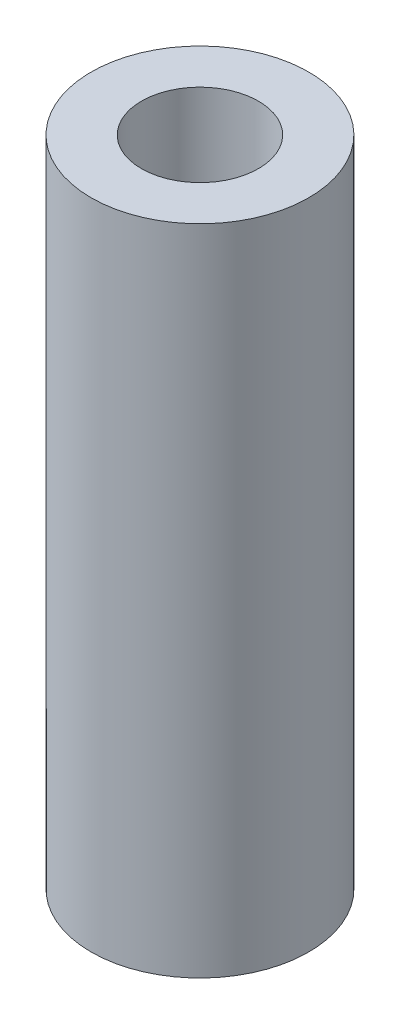
ISO-10303-21;
HEADER;
FILE_DESCRIPTION(('STEP AP214'),'2;1');
FILE_NAME('part.step','',(''),(''),'','','');
FILE_SCHEMA(('AUTOMOTIVE_DESIGN { 1 0 10303 214 1 1 1 1 }'));
ENDSEC;
DATA;
#1=APPLICATION_CONTEXT('core data for automotive mechanical design processes');
#2=APPLICATION_PROTOCOL_DEFINITION('international standard','automotive_design',2000,#1);
#3=PRODUCT_CONTEXT('',#1,'mechanical');
#4=PRODUCT('Part','Part','',(#3));
#5=PRODUCT_RELATED_PRODUCT_CATEGORY('part','',(#4));
#6=PRODUCT_DEFINITION_FORMATION('','',#4);
#7=PRODUCT_DEFINITION_CONTEXT('part definition',#1,'design');
#8=PRODUCT_DEFINITION('design','',#6,#7);
#9=PRODUCT_DEFINITION_SHAPE('','',#8);
#10=(LENGTH_UNIT() NAMED_UNIT(*) SI_UNIT(.MILLI.,.METRE.));
#11=(NAMED_UNIT(*) PLANE_ANGLE_UNIT() SI_UNIT($,.RADIAN.));
#12=(NAMED_UNIT(*) SI_UNIT($,.STERADIAN.) SOLID_ANGLE_UNIT());
#13=UNCERTAINTY_MEASURE_WITH_UNIT(LENGTH_MEASURE(1.E-05),#10,'distance_accuracy_value','');
#14=(GEOMETRIC_REPRESENTATION_CONTEXT(3) GLOBAL_UNCERTAINTY_ASSIGNED_CONTEXT((#13)) GLOBAL_UNIT_ASSIGNED_CONTEXT((#10,
#11,#12)) REPRESENTATION_CONTEXT('',''));
#15=CARTESIAN_POINT('',(0.,0.,0.));
#16=DIRECTION('',(0.,0.,1.));
#17=DIRECTION('',(1.,0.,0.));
#18=AXIS2_PLACEMENT_3D('',#15,#16,#17);
#19=CARTESIAN_POINT('',(0.,24.,0.));
#20=DIRECTION('',(0.,1.,0.));
#21=DIRECTION('',(0.,0.,1.));
#22=AXIS2_PLACEMENT_3D('',#19,#20,#21);
#23=PLANE('',#22);
#24=CARTESIAN_POINT('',(0.,24.,0.));
#25=DIRECTION('',(0.,1.,0.));
#26=DIRECTION('',(0.,0.,1.));
#27=AXIS2_PLACEMENT_3D('',#24,#25,#26);
#28=CIRCLE('',#27,4.);
#29=CARTESIAN_POINT('',(0.,24.,4.));
#30=VERTEX_POINT('',#29);
#31=EDGE_CURVE('E10',#30,#30,#28,.T.);
#32=ORIENTED_EDGE('',*,*,#31,.T.);
#33=EDGE_LOOP('',(#32));
#34=FACE_BOUND('',#33,.T.);
#35=CARTESIAN_POINT('',(0.,24.,0.));
#36=DIRECTION('',(0.,1.,0.));
#37=DIRECTION('',(0.,0.,1.));
#38=AXIS2_PLACEMENT_3D('',#35,#36,#37);
#39=CIRCLE('',#38,2.15);
#40=CARTESIAN_POINT('',(0.,24.,2.15));
#41=VERTEX_POINT('',#40);
#42=EDGE_CURVE('E56',#41,#41,#39,.T.);
#43=ORIENTED_EDGE('',*,*,#42,.F.);
#44=EDGE_LOOP('',(#43));
#45=FACE_BOUND('',#44,.T.);
#46=ADVANCED_FACE('F43',(#34,#45),#23,.T.);
#47=CARTESIAN_POINT('',(0.,0.,0.));
#48=DIRECTION('',(0.,1.,0.));
#49=DIRECTION('',(0.,0.,1.));
#50=AXIS2_PLACEMENT_3D('',#47,#48,#49);
#51=PLANE('',#50);
#52=CARTESIAN_POINT('',(0.,0.,0.));
#53=DIRECTION('',(0.,1.,0.));
#54=DIRECTION('',(0.,0.,1.));
#55=AXIS2_PLACEMENT_3D('',#52,#53,#54);
#56=CIRCLE('',#55,4.);
#57=CARTESIAN_POINT('',(0.,0.,4.));
#58=VERTEX_POINT('',#57);
#59=EDGE_CURVE('E47',#58,#58,#56,.T.);
#60=ORIENTED_EDGE('',*,*,#59,.F.);
#61=EDGE_LOOP('',(#60));
#62=FACE_BOUND('',#61,.T.);
#63=CARTESIAN_POINT('',(0.,0.,0.));
#64=DIRECTION('',(0.,1.,0.));
#65=DIRECTION('',(0.,0.,1.));
#66=AXIS2_PLACEMENT_3D('',#63,#64,#65);
#67=CIRCLE('',#66,2.15);
#68=CARTESIAN_POINT('',(0.,0.,2.15));
#69=VERTEX_POINT('',#68);
#70=EDGE_CURVE('E58',#69,#69,#67,.T.);
#71=ORIENTED_EDGE('',*,*,#70,.T.);
#72=EDGE_LOOP('',(#71));
#73=FACE_BOUND('',#72,.T.);
#74=ADVANCED_FACE('F70',(#62,#73),#51,.F.);
#75=CARTESIAN_POINT('',(0.,24.,0.));
#76=DIRECTION('',(0.,-1.,0.));
#77=DIRECTION('',(0.,0.,-1.));
#78=AXIS2_PLACEMENT_3D('',#75,#76,#77);
#79=CYLINDRICAL_SURFACE('',#78,4.);
#80=ORIENTED_EDGE('',*,*,#31,.F.);
#81=EDGE_LOOP('',(#80));
#82=FACE_BOUND('',#81,.T.);
#83=ORIENTED_EDGE('',*,*,#59,.T.);
#84=EDGE_LOOP('',(#83));
#85=FACE_BOUND('',#84,.T.);
#86=ADVANCED_FACE('F45',(#82,#85),#79,.T.);
#87=CARTESIAN_POINT('',(0.,24.,0.));
#88=DIRECTION('',(0.,-1.,0.));
#89=DIRECTION('',(0.,0.,-1.));
#90=AXIS2_PLACEMENT_3D('',#87,#88,#89);
#91=CYLINDRICAL_SURFACE('',#90,2.15);
#92=ORIENTED_EDGE('',*,*,#42,.T.);
#93=EDGE_LOOP('',(#92));
#94=FACE_BOUND('',#93,.T.);
#95=ORIENTED_EDGE('',*,*,#70,.F.);
#96=EDGE_LOOP('',(#95));
#97=FACE_BOUND('',#96,.T.);
#98=ADVANCED_FACE('F66',(#94,#97),#91,.F.);
#99=CLOSED_SHELL('',(#46,#74,#86,#98));
#100=MANIFOLD_SOLID_BREP('B2',#99);
#101=ADVANCED_BREP_SHAPE_REPRESENTATION('',(#18,#100),#14);
#102=SHAPE_DEFINITION_REPRESENTATION(#9,#101);
ENDSEC;
END-ISO-10303-21;
